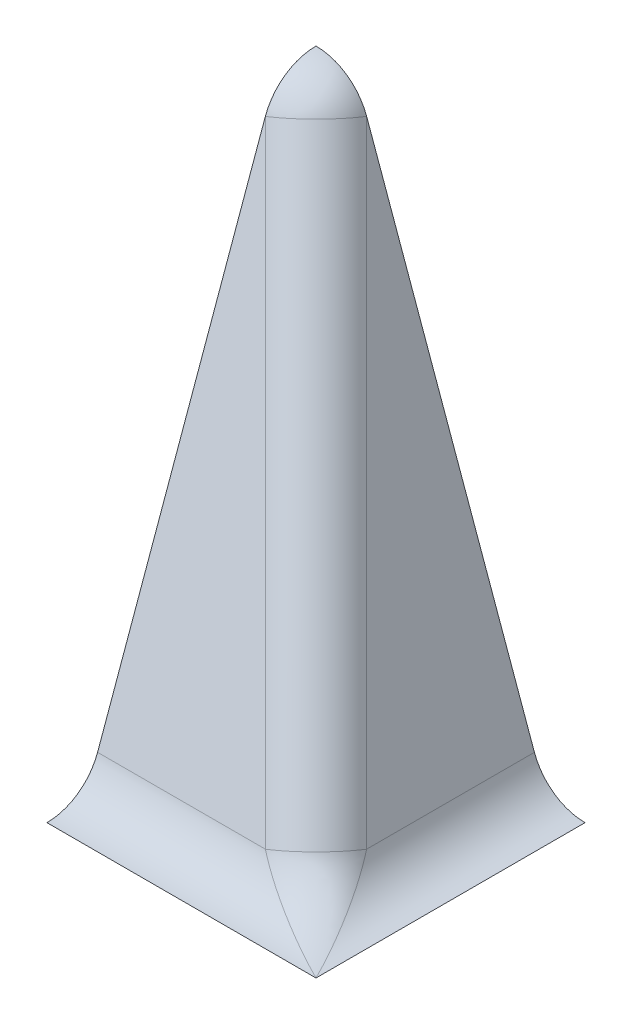
ISO-10303-21;
HEADER;
FILE_DESCRIPTION(('STEP AP214'),'2;1');
FILE_NAME('part.step','',(''),(''),'','','');
FILE_SCHEMA(('AUTOMOTIVE_DESIGN { 1 0 10303 214 1 1 1 1 }'));
ENDSEC;
DATA;
#1=APPLICATION_CONTEXT('core data for automotive mechanical design processes');
#2=APPLICATION_PROTOCOL_DEFINITION('international standard','automotive_design',2000,#1);
#3=PRODUCT_CONTEXT('',#1,'mechanical');
#4=PRODUCT('Part','Part','',(#3));
#5=PRODUCT_RELATED_PRODUCT_CATEGORY('part','',(#4));
#6=PRODUCT_DEFINITION_FORMATION('','',#4);
#7=PRODUCT_DEFINITION_CONTEXT('part definition',#1,'design');
#8=PRODUCT_DEFINITION('design','',#6,#7);
#9=PRODUCT_DEFINITION_SHAPE('','',#8);
#10=(LENGTH_UNIT() NAMED_UNIT(*) SI_UNIT(.MILLI.,.METRE.));
#11=(NAMED_UNIT(*) PLANE_ANGLE_UNIT() SI_UNIT($,.RADIAN.));
#12=(NAMED_UNIT(*) SI_UNIT($,.STERADIAN.) SOLID_ANGLE_UNIT());
#13=UNCERTAINTY_MEASURE_WITH_UNIT(LENGTH_MEASURE(1.E-05),#10,'distance_accuracy_value','');
#14=(GEOMETRIC_REPRESENTATION_CONTEXT(3) GLOBAL_UNCERTAINTY_ASSIGNED_CONTEXT((#13)) GLOBAL_UNIT_ASSIGNED_CONTEXT((#10,
#11,#12)) REPRESENTATION_CONTEXT('',''));
#15=CARTESIAN_POINT('',(0.,0.,0.));
#16=DIRECTION('',(0.,0.,1.));
#17=DIRECTION('',(1.,0.,0.));
#18=AXIS2_PLACEMENT_3D('',#15,#16,#17);
#19=CARTESIAN_POINT('',(1000.,200.,0.));
#20=DIRECTION('',(-1.,0.,0.));
#21=DIRECTION('',(0.,0.,1.));
#22=AXIS2_PLACEMENT_3D('',#19,#20,#21);
#23=CYLINDRICAL_SURFACE('',#22,200.);
#24=DIRECTION('',(-1.,0.,0.));
#25=VECTOR('',#24,1.);
#26=CARTESIAN_POINT('',(1000.,0.,0.));
#27=LINE('',#26,#25);
#28=CARTESIAN_POINT('',(1000.,0.,0.));
#29=VERTEX_POINT('',#28);
#30=CARTESIAN_POINT('',(0.,0.,0.));
#31=VERTEX_POINT('',#30);
#32=EDGE_CURVE('E99',#29,#31,#27,.T.);
#33=ORIENTED_EDGE('',*,*,#32,.F.);
#34=CARTESIAN_POINT('',(1000.,200.,0.));
#35=DIRECTION('',(0.447213595499958,0.,-0.894427190999916));
#36=DIRECTION('',(0.894427190999916,0.,0.447213595499958));
#37=AXIS2_PLACEMENT_3D('',#34,#35,#36);
#38=ELLIPSE('',#37,447.213595499958,200.);
#39=CARTESIAN_POINT('',(623.56694086138,132.364669019181,-188.21652956931));
#40=VERTEX_POINT('',#39);
#41=EDGE_CURVE('E54',#29,#40,#38,.T.);
#42=ORIENTED_EDGE('',*,*,#41,.T.);
#43=DIRECTION('',(-1.,0.,0.));
#44=VECTOR('',#43,1.);
#45=CARTESIAN_POINT('',(1000.,132.364669019181,-188.21652956931));
#46=LINE('',#45,#44);
#47=CARTESIAN_POINT('',(0.,132.364669019181,-188.21652956931));
#48=VERTEX_POINT('',#47);
#49=EDGE_CURVE('E100',#40,#48,#46,.T.);
#50=ORIENTED_EDGE('',*,*,#49,.T.);
#51=CARTESIAN_POINT('',(0.,200.,0.));
#52=DIRECTION('',(-1.,0.,0.));
#53=DIRECTION('',(0.,0.,-1.));
#54=AXIS2_PLACEMENT_3D('',#51,#52,#53);
#55=CIRCLE('',#54,200.);
#56=EDGE_CURVE('E123',#48,#31,#55,.T.);
#57=ORIENTED_EDGE('',*,*,#56,.T.);
#58=EDGE_LOOP('',(#33,#42,#50,#57));
#59=FACE_BOUND('',#58,.T.);
#60=ADVANCED_FACE('F33',(#59),#23,.F.);
#61=CARTESIAN_POINT('',(1000.,0.,-1000.));
#62=DIRECTION('',(0.,0.,1.));
#63=DIRECTION('',(1.,0.,0.));
#64=AXIS2_PLACEMENT_3D('',#61,#62,#63);
#65=PLANE('',#64);
#66=CARTESIAN_POINT('',(1000.,200.,-1000.));
#67=DIRECTION('',(0.,0.,1.));
#68=DIRECTION('',(1.,0.,0.));
#69=AXIS2_PLACEMENT_3D('',#66,#67,#68);
#70=CIRCLE('',#69,200.);
#71=CARTESIAN_POINT('',(811.78347043069,132.364669019181,-1000.));
#72=VERTEX_POINT('',#71);
#73=CARTESIAN_POINT('',(1000.,1.11022302462516E-13,-1000.));
#74=VERTEX_POINT('',#73);
#75=EDGE_CURVE('E103',#72,#74,#70,.T.);
#76=ORIENTED_EDGE('',*,*,#75,.T.);
#77=DIRECTION('',(-1.,0.,0.));
#78=VECTOR('',#77,1.);
#79=CARTESIAN_POINT('',(1000.,0.,-1000.));
#80=LINE('',#79,#78);
#81=CARTESIAN_POINT('',(0.,0.,-1000.));
#82=VERTEX_POINT('',#81);
#83=EDGE_CURVE('E90',#74,#82,#80,.T.);
#84=ORIENTED_EDGE('',*,*,#83,.T.);
#85=DIRECTION('',(0.,1.,0.));
#86=VECTOR('',#85,1.);
#87=CARTESIAN_POINT('',(0.,0.,-1000.));
#88=LINE('',#87,#86);
#89=CARTESIAN_POINT('',(0.,2000.,-1000.));
#90=VERTEX_POINT('',#89);
#91=EDGE_CURVE('E127',#82,#90,#88,.T.);
#92=ORIENTED_EDGE('',*,*,#91,.T.);
#93=CARTESIAN_POINT('',(0.,1800.,-1000.));
#94=DIRECTION('',(0.,0.,1.));
#95=DIRECTION('',(1.,0.,0.));
#96=AXIS2_PLACEMENT_3D('',#93,#94,#95);
#97=CIRCLE('',#96,200.);
#98=CARTESIAN_POINT('',(188.21652956931,1867.63533098082,-1000.));
#99=VERTEX_POINT('',#98);
#100=EDGE_CURVE('E164',#90,#99,#97,.F.);
#101=ORIENTED_EDGE('',*,*,#100,.T.);
#102=DIRECTION('',(0.338176654904095,-0.941082647846552,0.));
#103=VECTOR('',#102,1.);
#104=CARTESIAN_POINT('',(188.21652956931,1867.63533098082,-1000.));
#105=LINE('',#104,#103);
#106=EDGE_CURVE('E106',#99,#72,#105,.T.);
#107=ORIENTED_EDGE('',*,*,#106,.T.);
#108=EDGE_LOOP('',(#76,#84,#92,#101,#107));
#109=FACE_BOUND('',#108,.T.);
#110=ADVANCED_FACE('F104',(#109),#65,.F.);
#111=CARTESIAN_POINT('',(1000.,132.364669019181,-188.21652956931));
#112=DIRECTION('',(0.,-0.338176654904095,-0.941082647846552));
#113=DIRECTION('',(0.,0.941082647846552,-0.338176654904095));
#114=AXIS2_PLACEMENT_3D('',#111,#112,#113);
#115=PLANE('',#114);
#116=ORIENTED_EDGE('',*,*,#49,.F.);
#117=DIRECTION('',(0.320354031960646,-0.891485607518773,0.320354031960646));
#118=VECTOR('',#117,1.);
#119=CARTESIAN_POINT('',(19.3160424055727,1813.88238242762,-792.467428025117));
#120=LINE('',#119,#118);
#121=CARTESIAN_POINT('',(0.,1867.63533098082,-811.78347043069));
#122=VERTEX_POINT('',#121);
#123=EDGE_CURVE('E11',#40,#122,#120,.F.);
#124=ORIENTED_EDGE('',*,*,#123,.T.);
#125=DIRECTION('',(0.,-0.941082647846552,0.338176654904095));
#126=VECTOR('',#125,1.);
#127=CARTESIAN_POINT('',(0.,132.364669019181,-188.21652956931));
#128=LINE('',#127,#126);
#129=EDGE_CURVE('E113',#122,#48,#128,.T.);
#130=ORIENTED_EDGE('',*,*,#129,.T.);
#131=EDGE_LOOP('',(#116,#124,#130));
#132=FACE_BOUND('',#131,.T.);
#133=ADVANCED_FACE('F154',(#132),#115,.F.);
#134=CARTESIAN_POINT('',(1000.,0.,0.));
#135=DIRECTION('',(0.,1.,0.));
#136=DIRECTION('',(0.,0.,1.));
#137=AXIS2_PLACEMENT_3D('',#134,#135,#136);
#138=PLANE('',#137);
#139=DIRECTION('',(0.,0.,-1.));
#140=VECTOR('',#139,1.);
#141=CARTESIAN_POINT('',(0.,0.,0.));
#142=LINE('',#141,#140);
#143=EDGE_CURVE('E96',#31,#82,#142,.T.);
#144=ORIENTED_EDGE('',*,*,#143,.T.);
#145=ORIENTED_EDGE('',*,*,#83,.F.);
#146=DIRECTION('',(0.,0.,-1.));
#147=VECTOR('',#146,1.);
#148=CARTESIAN_POINT('',(1000.,0.,0.));
#149=LINE('',#148,#147);
#150=EDGE_CURVE('E95',#29,#74,#149,.T.);
#151=ORIENTED_EDGE('',*,*,#150,.F.);
#152=ORIENTED_EDGE('',*,*,#32,.T.);
#153=EDGE_LOOP('',(#144,#145,#151,#152));
#154=FACE_BOUND('',#153,.T.);
#155=ADVANCED_FACE('F92',(#154),#138,.F.);
#156=CARTESIAN_POINT('',(0.,200.,0.));
#157=DIRECTION('',(1.,0.,0.));
#158=DIRECTION('',(0.,0.,-1.));
#159=AXIS2_PLACEMENT_3D('',#156,#157,#158);
#160=PLANE('',#159);
#161=ORIENTED_EDGE('',*,*,#56,.F.);
#162=ORIENTED_EDGE('',*,*,#129,.F.);
#163=CARTESIAN_POINT('',(0.,1800.,-1000.));
#164=DIRECTION('',(1.,0.,0.));
#165=DIRECTION('',(0.,0.,-1.));
#166=AXIS2_PLACEMENT_3D('',#163,#164,#165);
#167=CIRCLE('',#166,200.);
#168=EDGE_CURVE('E117',#90,#122,#167,.T.);
#169=ORIENTED_EDGE('',*,*,#168,.F.);
#170=ORIENTED_EDGE('',*,*,#91,.F.);
#171=ORIENTED_EDGE('',*,*,#143,.F.);
#172=EDGE_LOOP('',(#161,#162,#169,#170,#171));
#173=FACE_BOUND('',#172,.T.);
#174=ADVANCED_FACE('F168',(#173),#160,.F.);
#175=CARTESIAN_POINT('',(188.21652956931,1867.63533098082,-5311.86217847897));
#176=DIRECTION('',(0.941082647846552,0.338176654904095,0.));
#177=DIRECTION('',(-0.338176654904095,0.941082647846552,0.));
#178=AXIS2_PLACEMENT_3D('',#175,#176,#177);
#179=PLANE('',#178);
#180=ORIENTED_EDGE('',*,*,#106,.F.);
#181=DIRECTION('',(0.320354031960646,-0.891485607518773,0.320354031960646));
#182=VECTOR('',#181,1.);
#183=CARTESIAN_POINT('',(831.099512836263,78.6117204659825,-357.117016733048));
#184=LINE('',#183,#182);
#185=CARTESIAN_POINT('',(811.78347043069,132.364669019181,-376.433059138621));
#186=VERTEX_POINT('',#185);
#187=EDGE_CURVE('E46',#99,#186,#184,.T.);
#188=ORIENTED_EDGE('',*,*,#187,.T.);
#189=DIRECTION('',(0.,0.,1.));
#190=VECTOR('',#189,1.);
#191=CARTESIAN_POINT('',(811.78347043069,132.364669019181,-5311.86217847897));
#192=LINE('',#191,#190);
#193=EDGE_CURVE('E121',#72,#186,#192,.T.);
#194=ORIENTED_EDGE('',*,*,#193,.F.);
#195=EDGE_LOOP('',(#180,#188,#194));
#196=FACE_BOUND('',#195,.T.);
#197=ADVANCED_FACE('F149',(#196),#179,.T.);
#198=CARTESIAN_POINT('',(1000.,200.,-5311.86217847897));
#199=DIRECTION('',(0.,0.,1.));
#200=DIRECTION('',(1.,0.,0.));
#201=AXIS2_PLACEMENT_3D('',#198,#199,#200);
#202=CYLINDRICAL_SURFACE('',#201,200.);
#203=ORIENTED_EDGE('',*,*,#193,.T.);
#204=CARTESIAN_POINT('',(1000.,200.,0.));
#205=DIRECTION('',(0.894427190999916,0.,-0.447213595499958));
#206=DIRECTION('',(0.447213595499958,0.,0.894427190999916));
#207=AXIS2_PLACEMENT_3D('',#204,#205,#206);
#208=ELLIPSE('',#207,447.213595499958,200.);
#209=EDGE_CURVE('E112',#186,#29,#208,.F.);
#210=ORIENTED_EDGE('',*,*,#209,.T.);
#211=ORIENTED_EDGE('',*,*,#150,.T.);
#212=ORIENTED_EDGE('',*,*,#75,.F.);
#213=EDGE_LOOP('',(#203,#210,#211,#212));
#214=FACE_BOUND('',#213,.T.);
#215=ADVANCED_FACE('F110',(#214),#202,.F.);
#216=CARTESIAN_POINT('',(1000.,400.,0.));
#217=CARTESIAN_POINT('',(1000.,400.,0.));
#218=CARTESIAN_POINT('',(1000.,400.,0.));
#219=CARTESIAN_POINT('',(995.643086084384,399.999985981453,-2.17845695781047));
#220=CARTESIAN_POINT('',(996.732312609739,400.000092570023,-3.26768739026429));
#221=CARTESIAN_POINT('',(997.821543042191,399.999985981453,-4.35691391562041));
#222=CARTESIAN_POINT('',(991.286179517606,399.964406855233,-4.35691024119943));
#223=CARTESIAN_POINT('',(993.464052759443,399.92881060137,-6.53594724056103));
#224=CARTESIAN_POINT('',(995.643089758803,399.964406855233,-8.71382048239853));
#225=CARTESIAN_POINT('',(982.574669451822,399.82201887214,-8.71266527409083));
#226=CARTESIAN_POINT('',(986.933911702083,399.644047213728,-13.0660882979194));
#227=CARTESIAN_POINT('',(991.287334725911,399.82201887214,-17.425330548182));
#228=CARTESIAN_POINT('',(978.220065966791,399.715209587856,-10.8899670166051));
#229=CARTESIAN_POINT('',(983.670870222134,399.430463598375,-16.3291297778671));
#230=CARTESIAN_POINT('',(989.110032983396,399.715209587856,-21.7799340332111));
#231=CARTESIAN_POINT('',(969.51514488863,399.430250055467,-15.242427555685));
#232=CARTESIAN_POINT('',(977.156161204687,398.861167658982,-22.8438387953141));
#233=CARTESIAN_POINT('',(984.757572444316,399.430250055466,-30.4848551113708));
#234=CARTESIAN_POINT('',(965.164827677374,399.25209394171,-17.4175861613135));
#235=CARTESIAN_POINT('',(973.903342500865,398.505240910315,-26.0966574991365));
#236=CARTESIAN_POINT('',(982.582413838687,399.252093941709,-34.8351723226273));
#237=CARTESIAN_POINT('',(956.4713314158,398.824251888562,-21.7643342921009));
#238=CARTESIAN_POINT('',(967.414748888116,397.65164210636,-32.585251111885));
#239=CARTESIAN_POINT('',(978.2356657079,398.824251888562,-43.5286685842015));
#240=CARTESIAN_POINT('',(952.128152352188,398.574566082532,-23.9359238239064));
#241=CARTESIAN_POINT('',(964.177836107292,397.153666443073,-35.8221638927084));
#242=CARTESIAN_POINT('',(976.064076176094,398.574566082532,-47.8718476478123));
#243=CARTESIAN_POINT('',(939.186777591037,397.722689535543,-30.4066112044808));
#244=CARTESIAN_POINT('',(954.548919349899,395.456004023807,-45.4510806501007));
#245=CARTESIAN_POINT('',(969.593388795519,397.722689535543,-60.8132224089625));
#246=CARTESIAN_POINT('',(930.601920145415,397.015230978533,-34.6990399272908));
#247=CARTESIAN_POINT('',(948.18952944113,394.047583849809,-51.8104705588706));
#248=CARTESIAN_POINT('',(965.300960072709,397.015230978533,-69.3980798545853));
#249=CARTESIAN_POINT('',(913.489281856307,395.315129402417,-43.2553590718452));
#250=CARTESIAN_POINT('',(935.606653135612,390.680936291135,-64.3933468643887));
#251=CARTESIAN_POINT('',(956.744640928155,395.315129402417,-86.510718143694));
#252=CARTESIAN_POINT('',(904.961499742667,394.322492751396,-47.5192501286662));
#253=CARTESIAN_POINT('',(929.374903381872,388.718008777085,-70.6250966181278));
#254=CARTESIAN_POINT('',(952.480749871334,394.322492751396,-95.0385002573331));
#255=CARTESIAN_POINT('',(888.125378045754,392.066877435512,-55.9373109771236));
#256=CARTESIAN_POINT('',(917.195997314521,384.287821824396,-82.8040026854787));
#257=CARTESIAN_POINT('',(944.062689022876,392.066877435512,-111.874621954246));
#258=CARTESIAN_POINT('',(879.815754761438,390.808702676096,-60.092122619281));
#259=CARTESIAN_POINT('',(911.23798283431,381.823375135851,-88.7620171656905));
#260=CARTESIAN_POINT('',(939.907877380719,390.808702676096,-120.184245238562));
#261=CARTESIAN_POINT('',(863.292903489369,388.007492375769,-68.3535482553159));
#262=CARTESIAN_POINT('',(899.543763921972,376.381422704712,-100.456236078029));
#263=CARTESIAN_POINT('',(931.646451744684,388.007492375769,-136.707096510632));
#264=CARTESIAN_POINT('',(855.079675085288,386.464458065641,-72.460162457357));
#265=CARTESIAN_POINT('',(893.80121785618,373.396627294825,-106.19878214382));
#266=CARTESIAN_POINT('',(927.539837542643,386.464458065641,-144.920324914712));
#267=CARTESIAN_POINT('',(838.974109747264,383.128886212486,-80.512945126367));
#268=CARTESIAN_POINT('',(882.727635063959,367.010399337594,-117.272364936041));
#269=CARTESIAN_POINT('',(919.487054873633,383.128886212486,-161.025890252736));
#270=CARTESIAN_POINT('',(831.078848851021,381.343418864328,-84.4605755744865));
#271=CARTESIAN_POINT('',(877.383950313126,363.612347830722,-122.616049686874));
#272=CARTESIAN_POINT('',(915.539424425514,381.343418864328,-168.92115114898));
#273=CARTESIAN_POINT('',(815.427750548502,377.488859412002,-92.2861247257468));
#274=CARTESIAN_POINT('',(867.006912782094,356.365157930276,-132.993087217906));
#275=CARTESIAN_POINT('',(907.713875274253,377.488859412002,-184.572249451499));
#276=CARTESIAN_POINT('',(807.671911417236,375.419770819662,-96.1640442913825));
#277=CARTESIAN_POINT('',(861.970056605789,352.507119717161,-138.02994339421));
#278=CARTESIAN_POINT('',(903.835955708618,375.419770819662,-192.328088582764));
#279=CARTESIAN_POINT('',(792.571839776744,371.060755602901,-103.714080111627));
#280=CARTESIAN_POINT('',(852.418347200413,344.501938805633,-147.581652799586));
#281=CARTESIAN_POINT('',(896.285919888373,371.0607556029,-207.428160223256));
#282=CARTESIAN_POINT('',(785.222358902956,368.779934070955,-107.388820548517));
#283=CARTESIAN_POINT('',(847.888677273831,340.357675596291,-152.111322726169));
#284=CARTESIAN_POINT('',(892.611179451483,368.779934070955,-214.777641097044));
#285=CARTESIAN_POINT('',(770.710229335422,363.937714172793,-114.644885332285));
#286=CARTESIAN_POINT('',(839.227149965009,331.715358093225,-160.772850034991));
#287=CARTESIAN_POINT('',(885.355114667715,363.937714172793,-229.289770664578));
#288=CARTESIAN_POINT('',(763.547577476896,361.376320563139,-118.226211261553));
#289=CARTESIAN_POINT('',(835.09536540267,327.208343433025,-164.90463459733));
#290=CARTESIAN_POINT('',(881.773788738447,361.376320563139,-236.452422523104));
#291=CARTESIAN_POINT('',(749.710652540207,356.067596911921,-125.144673729895));
#292=CARTESIAN_POINT('',(827.437444239726,318.07484094446,-172.562555760274));
#293=CARTESIAN_POINT('',(874.855326270105,356.067596911921,-250.289347459793));
#294=CARTESIAN_POINT('',(743.028159160945,353.330998288834,-128.48592041952));
#295=CARTESIAN_POINT('',(823.894393978917,313.449297258112,-176.105606021083));
#296=CARTESIAN_POINT('',(871.51407958048,353.330998288834,-256.971840839055));
#297=CARTESIAN_POINT('',(729.902805152029,347.583537593108,-135.048597423978));
#298=CARTESIAN_POINT('',(817.283079845907,303.988700727488,-182.716920154093));
#299=CARTESIAN_POINT('',(864.951402576022,347.583537593108,-270.097194847971));
#300=CARTESIAN_POINT('',(723.459938878611,344.572681985616,-138.270030560695));
#301=CARTESIAN_POINT('',(814.218714814165,299.146802125362,-185.781285185835));
#302=CARTESIAN_POINT('',(861.729969439305,344.572681985616,-276.540061121389));
#303=CARTESIAN_POINT('',(711.12247365067,338.403949231309,-144.438763174665));
#304=CARTESIAN_POINT('',(808.736842071907,289.553559350496,-191.263157928093));
#305=CARTESIAN_POINT('',(855.561236825335,338.403949231309,-288.87752634933));
#306=CARTESIAN_POINT('',(705.2162107649,335.257757246552,-147.391894617544));
#307=CARTESIAN_POINT('',(806.301136029742,284.799606398326,-193.698863970258));
#308=CARTESIAN_POINT('',(852.608105382456,335.257757246552,-294.7837892351));
#309=CARTESIAN_POINT('',(693.701903224748,328.702735209711,-153.149048387619));
#310=CARTESIAN_POINT('',(801.951889746767,275.280840530632,-198.048110253233));
#311=CARTESIAN_POINT('',(846.850951612381,328.70273520971,-306.298096775252));
#312=CARTESIAN_POINT('',(688.09384905676,325.29391354468,-155.953075471619));
#313=CARTESIAN_POINT('',(800.045370104668,270.513780500161,-199.954629895332));
#314=CARTESIAN_POINT('',(844.046924528381,325.29391354468,-311.90615094324));
#315=CARTESIAN_POINT('',(677.46704372681,318.369367760935,-161.266478136596));
#316=CARTESIAN_POINT('',(796.856754320209,261.307639268776,-203.143245679791));
#317=CARTESIAN_POINT('',(838.733521863404,318.369367760935,-322.53295627319));
#318=CARTESIAN_POINT('',(672.43314628237,314.865279727535,-163.783426858814));
#319=CARTESIAN_POINT('',(795.556998342448,256.861174928002,-204.443001657553));
#320=CARTESIAN_POINT('',(836.216573141186,314.865279727535,-327.56685371763));
#321=CARTESIAN_POINT('',(662.726812617503,307.613775327575,-168.636593691247));
#322=CARTESIAN_POINT('',(793.467455019395,248.20045050985,-206.532544980605));
#323=CARTESIAN_POINT('',(831.363406308753,307.613775327575,-337.273187382497));
#324=CARTESIAN_POINT('',(658.054361357503,303.866369097297,-170.972819321248));
#325=CARTESIAN_POINT('',(792.685740246229,243.99029937015,-207.31425975377));
#326=CARTESIAN_POINT('',(829.027180678752,303.866369097297,-341.945638642497));
#327=CARTESIAN_POINT('',(651.455328985735,298.151470647923,-174.272335507133));
#328=CARTESIAN_POINT('',(791.896712195577,238.070332878637,-208.103287804423));
#329=CARTESIAN_POINT('',(825.727664492867,298.151470647923,-348.544671014265));
#330=CARTESIAN_POINT('',(649.368348615612,296.275748272084,-175.315825692195));
#331=CARTESIAN_POINT('',(791.69798199305,236.192246969848,-208.30201800695));
#332=CARTESIAN_POINT('',(824.684174307805,296.275748272084,-350.631651384388));
#333=CARTESIAN_POINT('',(645.295198271302,292.470435736189,-177.352400864348));
#334=CARTESIAN_POINT('',(791.408622967789,232.539149687611,-208.591377032211));
#335=CARTESIAN_POINT('',(822.647599135652,292.470435736189,-354.704801728699));
#336=CARTESIAN_POINT('',(643.30901913715,290.540850495524,-178.345490431422));
#337=CARTESIAN_POINT('',(791.318806131024,230.765173276994,-208.681193868976));
#338=CARTESIAN_POINT('',(821.654509568578,290.540850495524,-356.69098086285));
#339=CARTESIAN_POINT('',(639.443563048263,286.628659888293,-180.278218475865));
#340=CARTESIAN_POINT('',(791.240601964452,227.336292244279,-208.759398035548));
#341=CARTESIAN_POINT('',(819.721781524135,286.628659888293,-360.556436951737));
#342=CARTESIAN_POINT('',(637.5642934001,284.646050911479,-181.21785329995));
#343=CARTESIAN_POINT('',(791.252969758162,225.682620479237,-208.747030241838));
#344=CARTESIAN_POINT('',(818.782146700051,284.646050911479,-362.435706599901));
#345=CARTESIAN_POINT('',(633.919407885684,280.629478514495,-183.040296057158));
#346=CARTESIAN_POINT('',(791.370097390905,222.509881543635,-208.629902609095));
#347=CARTESIAN_POINT('',(816.959703942842,280.629478514495,-366.080592114316));
#348=CARTESIAN_POINT('',(632.153780846175,278.595520170418,-183.923109576911));
#349=CARTESIAN_POINT('',(791.475492288582,220.992173845779,-208.524507711418));
#350=CARTESIAN_POINT('',(816.076890423089,278.595520170418,-367.846219153825));
#351=CARTESIAN_POINT('',(628.809266401561,274.558334507942,-185.595366799221));
#352=CARTESIAN_POINT('',(791.761561563591,218.161775569073,-208.238438436408));
#353=CARTESIAN_POINT('',(814.404633200779,274.558334507942,-371.190733598439));
#354=CARTESIAN_POINT('',(627.225777226387,272.557013979082,-186.387111386813));
#355=CARTESIAN_POINT('',(791.939634460055,216.844370913283,-208.060365539945));
#356=CARTESIAN_POINT('',(813.612888613188,272.557013979082,-372.774222773613));
#357=CARTESIAN_POINT('',(624.17568256302,268.510545717426,-187.912158718483));
#358=CARTESIAN_POINT('',(792.358454091456,214.356757704865,-207.641545908545));
#359=CARTESIAN_POINT('',(812.087841281517,268.510545717426,-375.82431743698));
#360=CARTESIAN_POINT('',(622.709064834409,266.46540260289,-188.645467582771));
#361=CARTESIAN_POINT('',(792.59952144573,213.187906858608,-207.400478554271));
#362=CARTESIAN_POINT('',(811.354532417229,266.46540260289,-377.290935165591));
#363=CARTESIAN_POINT('',(619.898349194697,262.333346145366,-190.050825402628));
#364=CARTESIAN_POINT('',(793.130335092017,211.004712439734,-206.869664907983));
#365=CARTESIAN_POINT('',(809.949174597373,262.333346145366,-380.101650805303));
#366=CARTESIAN_POINT('',(618.554254300683,260.246431775316,-190.722872849653));
#367=CARTESIAN_POINT('',(793.420269822428,209.991753526072,-206.579730177572));
#368=CARTESIAN_POINT('',(809.277127150348,260.246431775316,-381.445745699317));
#369=CARTESIAN_POINT('',(615.994360386626,256.033593081591,-192.002819806693));
#370=CARTESIAN_POINT('',(794.033154462321,208.124435099188,-205.966845537679));
#371=CARTESIAN_POINT('',(807.997180193307,256.033593081591,-384.005639613374));
#372=CARTESIAN_POINT('',(614.778560617184,253.907668985866,-192.610719691407));
#373=CARTESIAN_POINT('',(794.356149455917,207.271408269226,-205.643850544083));
#374=CARTESIAN_POINT('',(807.389280308593,253.907668985866,-385.221439382816));
#375=CARTESIAN_POINT('',(612.515078712207,249.683954397237,-193.742460643897));
#376=CARTESIAN_POINT('',(795.008313290212,205.747071662117,-204.991686709787));
#377=CARTESIAN_POINT('',(806.257539356103,249.683954397237,-387.484921287793));
#378=CARTESIAN_POINT('',(611.46346107466,247.587218875031,-194.268269462678));
#379=CARTESIAN_POINT('',(795.336977119013,205.072124765915,-204.663022880987));
#380=CARTESIAN_POINT('',(805.731730537322,247.587218875031,-388.53653892534));
#381=CARTESIAN_POINT('',(609.490918247829,243.363208423579,-195.254540876077));
#382=CARTESIAN_POINT('',(795.993395580669,203.867077836458,-204.006604419331));
#383=CARTESIAN_POINT('',(804.745459123923,243.363208423579,-390.509081752171));
#384=CARTESIAN_POINT('',(608.569992386733,241.235933651379,-195.715003806599));
#385=CARTESIAN_POINT('',(796.320968312562,203.337967669178,-203.679031687438));
#386=CARTESIAN_POINT('',(804.284996193401,241.235933651379,-391.430007613267));
#387=CARTESIAN_POINT('',(606.863227036165,236.954485862649,-196.568386481883));
#388=CARTESIAN_POINT('',(796.959113342349,202.415700283198,-203.040886657651));
#389=CARTESIAN_POINT('',(803.431613518117,236.954485862649,-393.136772963835));
#390=CARTESIAN_POINT('',(606.077384445666,234.800313464809,-196.961307777158));
#391=CARTESIAN_POINT('',(797.269429152224,202.023361861688,-202.730570847776));
#392=CARTESIAN_POINT('',(803.038692222842,234.800313464809,-393.922615554334));
#393=CARTESIAN_POINT('',(604.644663424254,230.46896392002,-197.677668287882));
#394=CARTESIAN_POINT('',(797.857661106272,201.361010382628,-202.142338893728));
#395=CARTESIAN_POINT('',(802.322331712118,230.46896392002,-395.355336575746));
#396=CARTESIAN_POINT('',(603.997784611628,228.291786836278,-198.001107694188));
#397=CARTESIAN_POINT('',(798.135279128516,201.091629232477,-201.864720871484));
#398=CARTESIAN_POINT('',(801.998892305812,228.291786836278,-396.002215388372));
#399=CARTESIAN_POINT('',(602.855711395462,223.95433352809,-198.572144302267));
#400=CARTESIAN_POINT('',(798.63998164395,200.660540517236,-201.36001835605));
#401=CARTESIAN_POINT('',(801.427855697733,223.95433352809,-397.144288604538));
#402=CARTESIAN_POINT('',(602.35821624178,221.794360341522,-198.820891879111));
#403=CARTESIAN_POINT('',(798.867538134501,200.497561135597,-201.132461865499));
#404=CARTESIAN_POINT('',(801.179108120889,221.794360341522,-397.64178375822));
#405=CARTESIAN_POINT('',(601.503478989636,217.460574635524,-199.248260505181));
#406=CARTESIAN_POINT('',(799.26652140357,200.251090198701,-200.73347859643));
#407=CARTESIAN_POINT('',(800.751739494819,217.460574635524,-398.496521010364));
#408=CARTESIAN_POINT('',(601.146236323297,215.286762172166,-199.426881838344));
#409=CARTESIAN_POINT('',(799.437694426338,200.1678497901,-200.562305573662));
#410=CARTESIAN_POINT('',(800.573118161656,215.286762172166,-398.853763676703));
#411=CARTESIAN_POINT('',(600.57388500817,210.929813276401,-199.713057495908));
#412=CARTESIAN_POINT('',(799.715319836448,200.056343589536,-200.284680163552));
#413=CARTESIAN_POINT('',(800.286942504092,210.929813276401,-399.42611499183));
#414=CARTESIAN_POINT('',(600.358775000452,208.746676933341,-199.820612499772));
#415=CARTESIAN_POINT('',(799.821583381844,200.028194618874,-200.178416618157));
#416=CARTESIAN_POINT('',(800.179387500228,208.746676933341,-399.641224999549));
#417=CARTESIAN_POINT('',(600.07183241835,204.375693730272,-199.964083790827));
#418=CARTESIAN_POINT('',(799.963974064214,200.000010269645,-200.036025935786));
#419=CARTESIAN_POINT('',(800.035916209173,204.375693730272,-399.92816758165));
#420=CARTESIAN_POINT('',(600.,202.187846865136,-200.));
#421=CARTESIAN_POINT('',(800.,200.000005135745,-200.));
#422=CARTESIAN_POINT('',(800.,202.187846865136,-400.));
#423=CARTESIAN_POINT('',(600.,197.812153134864,-200.));
#424=CARTESIAN_POINT('',(800.,199.999994864255,-200.));
#425=CARTESIAN_POINT('',(800.,197.812153134864,-400.));
#426=CARTESIAN_POINT('',(600.07183241835,195.624306269728,-199.964083790827));
#427=CARTESIAN_POINT('',(799.963974064214,199.999989730355,-200.036025935786));
#428=CARTESIAN_POINT('',(800.035916209173,195.624306269728,-399.92816758165));
#429=CARTESIAN_POINT('',(600.358775000452,191.253323066659,-199.820612499772));
#430=CARTESIAN_POINT('',(799.821583381844,199.971805381126,-200.178416618156));
#431=CARTESIAN_POINT('',(800.179387500228,191.253323066659,-399.641224999549));
#432=CARTESIAN_POINT('',(600.57388500817,189.070186723599,-199.713057495908));
#433=CARTESIAN_POINT('',(799.715319836448,199.943656410464,-200.284680163552));
#434=CARTESIAN_POINT('',(800.286942504092,189.070186723599,-399.42611499183));
#435=CARTESIAN_POINT('',(601.146236323297,184.713237827834,-199.426881838344));
#436=CARTESIAN_POINT('',(799.437694426338,199.8321502099,-200.562305573662));
#437=CARTESIAN_POINT('',(800.573118161656,184.713237827834,-398.853763676703));
#438=CARTESIAN_POINT('',(601.503478989636,182.539425364476,-199.248260505181));
#439=CARTESIAN_POINT('',(799.26652140357,199.748909801299,-200.73347859643));
#440=CARTESIAN_POINT('',(800.751739494819,182.539425364476,-398.496521010364));
#441=CARTESIAN_POINT('',(602.35821624178,178.205639658478,-198.820891879111));
#442=CARTESIAN_POINT('',(798.867538134501,199.502438864403,-201.132461865499));
#443=CARTESIAN_POINT('',(801.179108120889,178.205639658478,-397.64178375822));
#444=CARTESIAN_POINT('',(602.855711395462,176.04566647191,-198.572144302267));
#445=CARTESIAN_POINT('',(798.63998164395,199.339459482764,-201.36001835605));
#446=CARTESIAN_POINT('',(801.427855697733,176.04566647191,-397.144288604538));
#447=CARTESIAN_POINT('',(603.997784611628,171.708213163722,-198.001107694188));
#448=CARTESIAN_POINT('',(798.135279128516,198.908370767524,-201.864720871484));
#449=CARTESIAN_POINT('',(801.998892305812,171.708213163722,-396.002215388372));
#450=CARTESIAN_POINT('',(604.644663424254,169.53103607998,-197.677668287882));
#451=CARTESIAN_POINT('',(797.857661106272,198.638989617372,-202.142338893728));
#452=CARTESIAN_POINT('',(802.322331712118,169.53103607998,-395.355336575746));
#453=CARTESIAN_POINT('',(606.077384445666,165.199686535191,-196.961307777158));
#454=CARTESIAN_POINT('',(797.269429152224,197.976638138312,-202.730570847776));
#455=CARTESIAN_POINT('',(803.038692222842,165.199686535191,-393.922615554334));
#456=CARTESIAN_POINT('',(606.863227036165,163.045514137351,-196.568386481883));
#457=CARTESIAN_POINT('',(796.959113342349,197.584299716802,-203.040886657652));
#458=CARTESIAN_POINT('',(803.431613518117,163.045514137351,-393.136772963835));
#459=CARTESIAN_POINT('',(608.569992386733,158.764066348621,-195.715003806599));
#460=CARTESIAN_POINT('',(796.320968312562,196.662032330822,-203.679031687438));
#461=CARTESIAN_POINT('',(804.284996193401,158.764066348621,-391.430007613267));
#462=CARTESIAN_POINT('',(609.490918247829,156.636791576421,-195.254540876077));
#463=CARTESIAN_POINT('',(795.993395580669,196.132922163542,-204.006604419331));
#464=CARTESIAN_POINT('',(804.745459123923,156.636791576421,-390.509081752171));
#465=CARTESIAN_POINT('',(611.46346107466,152.412781124969,-194.268269462678));
#466=CARTESIAN_POINT('',(795.336977119013,194.927875234085,-204.663022880987));
#467=CARTESIAN_POINT('',(805.731730537322,152.412781124969,-388.53653892534));
#468=CARTESIAN_POINT('',(612.515078712207,150.316045602763,-193.742460643897));
#469=CARTESIAN_POINT('',(795.008313290213,194.252928337883,-204.991686709788));
#470=CARTESIAN_POINT('',(806.257539356103,150.316045602763,-387.484921287793));
#471=CARTESIAN_POINT('',(614.778560617184,146.092331014134,-192.610719691407));
#472=CARTESIAN_POINT('',(794.356149455917,192.728591730774,-205.643850544083));
#473=CARTESIAN_POINT('',(807.389280308593,146.092331014134,-385.221439382816));
#474=CARTESIAN_POINT('',(615.994360386626,143.966406918409,-192.002819806693));
#475=CARTESIAN_POINT('',(794.033154462321,191.875564900812,-205.966845537679));
#476=CARTESIAN_POINT('',(807.997180193307,143.966406918409,-384.005639613374));
#477=CARTESIAN_POINT('',(618.554254300683,139.753568224684,-190.722872849653));
#478=CARTESIAN_POINT('',(793.420269822428,190.008246473928,-206.579730177572));
#479=CARTESIAN_POINT('',(809.277127150347,139.753568224684,-381.445745699317));
#480=CARTESIAN_POINT('',(619.898349194697,137.666653854634,-190.050825402628));
#481=CARTESIAN_POINT('',(793.130335092017,188.995287560266,-206.869664907983));
#482=CARTESIAN_POINT('',(809.949174597372,137.666653854634,-380.101650805303));
#483=CARTESIAN_POINT('',(622.709064834409,133.53459739711,-188.645467582771));
#484=CARTESIAN_POINT('',(792.599521445729,186.812093141392,-207.400478554271));
#485=CARTESIAN_POINT('',(811.354532417229,133.53459739711,-377.290935165591));
#486=CARTESIAN_POINT('',(624.17568256302,131.489454282574,-187.912158718483));
#487=CARTESIAN_POINT('',(792.358454091456,185.643242295135,-207.641545908545));
#488=CARTESIAN_POINT('',(812.087841281517,131.489454282574,-375.82431743698));
#489=CARTESIAN_POINT('',(627.225777226387,127.442986020918,-186.387111386813));
#490=CARTESIAN_POINT('',(791.939634460055,183.155629086717,-208.060365539945));
#491=CARTESIAN_POINT('',(813.612888613188,127.442986020918,-372.774222773613));
#492=CARTESIAN_POINT('',(628.809266401561,125.441665492058,-185.595366799221));
#493=CARTESIAN_POINT('',(791.761561563591,181.838224430927,-208.238438436409));
#494=CARTESIAN_POINT('',(814.404633200779,125.441665492058,-371.190733598439));
#495=CARTESIAN_POINT('',(632.153780846175,121.404479829582,-183.923109576911));
#496=CARTESIAN_POINT('',(791.475492288582,179.007826154221,-208.524507711418));
#497=CARTESIAN_POINT('',(816.076890423089,121.404479829582,-367.846219153825));
#498=CARTESIAN_POINT('',(633.919407885684,119.370521485505,-183.040296057158));
#499=CARTESIAN_POINT('',(791.370097390906,177.490118456365,-208.629902609095));
#500=CARTESIAN_POINT('',(816.959703942842,119.370521485505,-366.080592114316));
#501=CARTESIAN_POINT('',(637.564293400099,115.353949088521,-181.21785329995));
#502=CARTESIAN_POINT('',(791.252969758162,174.317379520763,-208.747030241838));
#503=CARTESIAN_POINT('',(818.782146700051,115.353949088521,-362.435706599901));
#504=CARTESIAN_POINT('',(639.443563048263,113.371340111707,-180.278218475865));
#505=CARTESIAN_POINT('',(791.240601964452,172.663707755721,-208.759398035548));
#506=CARTESIAN_POINT('',(819.721781524135,113.371340111707,-360.556436951737));
#507=CARTESIAN_POINT('',(643.30901913715,109.459149504476,-178.345490431422));
#508=CARTESIAN_POINT('',(791.318806131024,169.234826723006,-208.681193868976));
#509=CARTESIAN_POINT('',(821.654509568578,109.459149504476,-356.69098086285));
#510=CARTESIAN_POINT('',(645.295198271302,107.529564263811,-177.352400864348));
#511=CARTESIAN_POINT('',(791.408622967789,167.460850312389,-208.591377032211));
#512=CARTESIAN_POINT('',(822.647599135652,107.529564263811,-354.704801728699));
#513=CARTESIAN_POINT('',(649.368348615612,103.724251727916,-175.315825692195));
#514=CARTESIAN_POINT('',(791.69798199305,163.807753030152,-208.30201800695));
#515=CARTESIAN_POINT('',(824.684174307805,103.724251727916,-350.631651384388));
#516=CARTESIAN_POINT('',(651.455328985735,101.848529352077,-174.272335507133));
#517=CARTESIAN_POINT('',(791.896712195577,161.929667121363,-208.103287804423));
#518=CARTESIAN_POINT('',(825.727664492867,101.848529352077,-348.544671014265));
#519=CARTESIAN_POINT('',(658.054361357503,96.1336309027033,-170.972819321248));
#520=CARTESIAN_POINT('',(792.685740246229,156.00970062985,-207.314259753771));
#521=CARTESIAN_POINT('',(829.027180678752,96.1336309027034,-341.945638642497));
#522=CARTESIAN_POINT('',(662.726812617503,92.3862246724251,-168.636593691247));
#523=CARTESIAN_POINT('',(793.467455019395,151.79954949015,-206.532544980605));
#524=CARTESIAN_POINT('',(831.363406308753,92.3862246724251,-337.273187382497));
#525=CARTESIAN_POINT('',(672.43314628237,85.1347202724654,-163.783426858814));
#526=CARTESIAN_POINT('',(795.556998342448,143.138825071998,-204.443001657552));
#527=CARTESIAN_POINT('',(836.216573141186,85.1347202724654,-327.56685371763));
#528=CARTESIAN_POINT('',(677.46704372681,81.6306322390649,-161.266478136596));
#529=CARTESIAN_POINT('',(796.856754320209,138.692360731224,-203.143245679791));
#530=CARTESIAN_POINT('',(838.733521863404,81.6306322390649,-322.53295627319));
#531=CARTESIAN_POINT('',(688.09384905676,74.7060864553202,-155.953075471619));
#532=CARTESIAN_POINT('',(800.045370104668,129.486219499839,-199.954629895332));
#533=CARTESIAN_POINT('',(844.046924528381,74.7060864553202,-311.90615094324));
#534=CARTESIAN_POINT('',(693.701903224748,71.2972647902895,-153.149048387619));
#535=CARTESIAN_POINT('',(801.951889746767,124.719159469368,-198.048110253233));
#536=CARTESIAN_POINT('',(846.850951612381,71.2972647902896,-306.298096775252));
#537=CARTESIAN_POINT('',(705.216210764899,64.7422427534482,-147.391894617544));
#538=CARTESIAN_POINT('',(806.301136029742,115.200393601674,-193.698863970258));
#539=CARTESIAN_POINT('',(852.608105382456,64.7422427534483,-294.783789235101));
#540=CARTESIAN_POINT('',(711.12247365067,61.5960507686907,-144.438763174665));
#541=CARTESIAN_POINT('',(808.736842071907,110.446440649504,-191.263157928093));
#542=CARTESIAN_POINT('',(855.561236825335,61.5960507686907,-288.87752634933));
#543=CARTESIAN_POINT('',(723.45993887861,55.4273180143845,-138.270030560695));
#544=CARTESIAN_POINT('',(814.218714814164,100.853197874638,-185.781285185836));
#545=CARTESIAN_POINT('',(861.729969439305,55.4273180143846,-276.54006112139));
#546=CARTESIAN_POINT('',(729.902805152029,52.4164624068919,-135.048597423978));
#547=CARTESIAN_POINT('',(817.283079845907,96.0112992725121,-182.716920154093));
#548=CARTESIAN_POINT('',(864.951402576022,52.416462406892,-270.097194847971));
#549=CARTESIAN_POINT('',(743.028159160945,46.6690017111664,-128.48592041952));
#550=CARTESIAN_POINT('',(823.894393978917,86.5507027418883,-176.105606021083));
#551=CARTESIAN_POINT('',(871.51407958048,46.6690017111664,-256.971840839055));
#552=CARTESIAN_POINT('',(749.710652540207,43.9324030880791,-125.144673729895));
#553=CARTESIAN_POINT('',(827.437444239726,81.9251590555399,-172.562555760274));
#554=CARTESIAN_POINT('',(874.855326270105,43.9324030880792,-250.289347459793));
#555=CARTESIAN_POINT('',(763.547577476896,38.6236794368614,-118.226211261553));
#556=CARTESIAN_POINT('',(835.09536540267,72.7916565669757,-164.90463459733));
#557=CARTESIAN_POINT('',(881.773788738447,38.6236794368615,-236.452422523104));
#558=CARTESIAN_POINT('',(770.710229335422,36.0622858272075,-114.644885332285));
#559=CARTESIAN_POINT('',(839.227149965009,68.2846419067751,-160.772850034991));
#560=CARTESIAN_POINT('',(885.355114667715,36.0622858272076,-229.289770664578));
#561=CARTESIAN_POINT('',(785.222358902956,31.2200659290454,-107.388820548517));
#562=CARTESIAN_POINT('',(847.888677273831,59.6423244037097,-152.111322726169));
#563=CARTESIAN_POINT('',(892.611179451483,31.2200659290455,-214.777641097044));
#564=CARTESIAN_POINT('',(792.571839776744,28.9392443970995,-103.714080111627));
#565=CARTESIAN_POINT('',(852.418347200413,55.4980611943672,-147.581652799587));
#566=CARTESIAN_POINT('',(896.285919888373,28.9392443970996,-207.428160223256));
#567=CARTESIAN_POINT('',(807.671911417236,24.5802291803378,-96.1640442913826));
#568=CARTESIAN_POINT('',(861.970056605789,47.4928802828391,-138.029943394211));
#569=CARTESIAN_POINT('',(903.835955708617,24.5802291803379,-192.328088582764));
#570=CARTESIAN_POINT('',(815.427750548502,22.5111405879985,-92.2861247257468));
#571=CARTESIAN_POINT('',(867.006912782094,43.6348420697245,-132.993087217906));
#572=CARTESIAN_POINT('',(907.713875274253,22.5111405879985,-184.572249451499));
#573=CARTESIAN_POINT('',(831.078848851021,18.6565811356724,-84.4605755744866));
#574=CARTESIAN_POINT('',(877.383950313126,36.3876521692776,-122.616049686874));
#575=CARTESIAN_POINT('',(915.539424425514,18.6565811356724,-168.92115114898));
#576=CARTESIAN_POINT('',(838.974109747264,16.8711137875135,-80.512945126367));
#577=CARTESIAN_POINT('',(882.727635063959,32.9896006624055,-117.272364936041));
#578=CARTESIAN_POINT('',(919.487054873633,16.8711137875136,-161.025890252736));
#579=CARTESIAN_POINT('',(855.079675085288,13.5355419343586,-72.460162457357));
#580=CARTESIAN_POINT('',(893.80121785618,26.603372705175,-106.19878214382));
#581=CARTESIAN_POINT('',(927.539837542643,13.5355419343587,-144.920324914712));
#582=CARTESIAN_POINT('',(863.292903489369,11.9925076242314,-68.3535482553159));
#583=CARTESIAN_POINT('',(899.543763921972,23.6185772952886,-100.456236078029));
#584=CARTESIAN_POINT('',(931.646451744684,11.9925076242314,-136.707096510632));
#585=CARTESIAN_POINT('',(879.815754761438,9.19129732390438,-60.092122619281));
#586=CARTESIAN_POINT('',(911.23798283431,18.1766248641487,-88.7620171656905));
#587=CARTESIAN_POINT('',(939.907877380719,9.1912973239044,-120.184245238562));
#588=CARTESIAN_POINT('',(888.125378045754,7.93312256448784,-55.9373109771236));
#589=CARTESIAN_POINT('',(917.195997314521,15.7121781756043,-82.8040026854786));
#590=CARTESIAN_POINT('',(944.062689022876,7.93312256448795,-111.874621954246));
#591=CARTESIAN_POINT('',(904.961499742667,5.67750724860377,-47.5192501286662));
#592=CARTESIAN_POINT('',(929.374903381872,11.2819912229149,-70.6250966181278));
#593=CARTESIAN_POINT('',(952.480749871334,5.67750724860388,-95.0385002573331));
#594=CARTESIAN_POINT('',(913.489281856307,4.68487059758345,-43.2553590718452));
#595=CARTESIAN_POINT('',(935.606653135612,9.31906370886485,-64.3933468643888));
#596=CARTESIAN_POINT('',(956.744640928155,4.68487059758347,-86.510718143694));
#597=CARTESIAN_POINT('',(930.601920145415,2.98476902146667,-34.6990399272909));
#598=CARTESIAN_POINT('',(948.18952944113,5.95241615019127,-51.8104705588707));
#599=CARTESIAN_POINT('',(965.300960072709,2.9847690214667,-69.3980798545854));
#600=CARTESIAN_POINT('',(939.186777591037,2.27731046445666,-30.4066112044809));
#601=CARTESIAN_POINT('',(954.548919349899,4.54399597619346,-45.4510806501008));
#602=CARTESIAN_POINT('',(969.593388795519,2.27731046445682,-60.8132224089626));
#603=CARTESIAN_POINT('',(952.128152352188,1.42543391746821,-23.9359238239063));
#604=CARTESIAN_POINT('',(964.177836107292,2.84633355692705,-35.8221638927083));
#605=CARTESIAN_POINT('',(976.064076176094,1.4254339174683,-47.8718476478123));
#606=CARTESIAN_POINT('',(956.4713314158,1.17574811143782,-21.7643342921008));
#607=CARTESIAN_POINT('',(967.414748888116,2.34835789364005,-32.5852511118848));
#608=CARTESIAN_POINT('',(978.2356657079,1.17574811143785,-43.5286685842012));
#609=CARTESIAN_POINT('',(965.164827677374,0.74790605829047,-17.4175861613134));
#610=CARTESIAN_POINT('',(973.903342500865,1.49475908968538,-26.0966574991363));
#611=CARTESIAN_POINT('',(982.582413838687,0.747906058290495,-34.8351723226271));
#612=CARTESIAN_POINT('',(969.51514488863,0.569749944533539,-15.2424275556849));
#613=CARTESIAN_POINT('',(977.156161204687,1.13883234101753,-22.843838795314));
#614=CARTESIAN_POINT('',(984.757572444316,0.569749944533616,-30.4848551113708));
#615=CARTESIAN_POINT('',(978.220065966791,0.284790412144458,-10.8899670166052));
#616=CARTESIAN_POINT('',(983.670870222134,0.569536401624743,-16.3291297778672));
#617=CARTESIAN_POINT('',(989.110032983396,0.284790412144547,-21.7799340332112));
#618=CARTESIAN_POINT('',(982.574669451822,0.177981127860184,-8.71266527409089));
#619=CARTESIAN_POINT('',(986.933911702083,0.355952786272244,-13.0660882979195));
#620=CARTESIAN_POINT('',(991.287334725911,0.177981127860231,-17.4253305481822));
#621=CARTESIAN_POINT('',(991.286179517606,0.0355931447666844,-4.35691024119948));
#622=CARTESIAN_POINT('',(993.464052759443,0.0711893986299144,-6.53594724056111));
#623=CARTESIAN_POINT('',(995.643089758803,0.0355931447666931,-8.71382048239864));
#624=CARTESIAN_POINT('',(995.643086084384,1.40185472185601E-05,-2.17845695781052));
#625=CARTESIAN_POINT('',(996.732312609739,-9.25700227975755E-05,-3.26768739026435));
#626=CARTESIAN_POINT('',(997.821543042191,1.40185472314499E-05,-4.3569139156205));
#627=CARTESIAN_POINT('',(1000.,0.,0.));
#628=CARTESIAN_POINT('',(1000.,1.66533453693773E-13,0.));
#629=CARTESIAN_POINT('',(1000.,1.11022302462516E-13,0.));
#630=(BOUNDED_SURFACE() B_SPLINE_SURFACE(3,2,((#216,#217,#218),(#219,#220,#221),(#222,#223,
#224),(#225,#226,#227),(#228,#229,#230),(#231,#232,#233),(#234,#235,#236),(#237,#238,#239),
(#240,#241,#242),(#243,#244,#245),(#246,#247,#248),(#249,#250,#251),(#252,#253,#254),(#255,#256,
#257),(#258,#259,#260),(#261,#262,#263),(#264,#265,#266),(#267,#268,#269),(#270,#271,#272),
(#273,#274,#275),(#276,#277,#278),(#279,#280,#281),(#282,#283,#284),(#285,#286,#287),(#288,#289,
#290),(#291,#292,#293),(#294,#295,#296),(#297,#298,#299),(#300,#301,#302),(#303,#304,#305),
(#306,#307,#308),(#309,#310,#311),(#312,#313,#314),(#315,#316,#317),(#318,#319,#320),(#321,#322,
#323),(#324,#325,#326),(#327,#328,#329),(#330,#331,#332),(#333,#334,#335),(#336,#337,#338),
(#339,#340,#341),(#342,#343,#344),(#345,#346,#347),(#348,#349,#350),(#351,#352,#353),(#354,#355,
#356),(#357,#358,#359),(#360,#361,#362),(#363,#364,#365),(#366,#367,#368),(#369,#370,#371),
(#372,#373,#374),(#375,#376,#377),(#378,#379,#380),(#381,#382,#383),(#384,#385,#386),(#387,#388,
#389),(#390,#391,#392),(#393,#394,#395),(#396,#397,#398),(#399,#400,#401),(#402,#403,#404),
(#405,#406,#407),(#408,#409,#410),(#411,#412,#413),(#414,#415,#416),(#417,#418,#419),(#420,#421,
#422),(#423,#424,#425),(#426,#427,#428),(#429,#430,#431),(#432,#433,#434),(#435,#436,#437),
(#438,#439,#440),(#441,#442,#443),(#444,#445,#446),(#447,#448,#449),(#450,#451,#452),(#453,#454,
#455),(#456,#457,#458),(#459,#460,#461),(#462,#463,#464),(#465,#466,#467),(#468,#469,#470),
(#471,#472,#473),(#474,#475,#476),(#477,#478,#479),(#480,#481,#482),(#483,#484,#485),(#486,#487,
#488),(#489,#490,#491),(#492,#493,#494),(#495,#496,#497),(#498,#499,#500),(#501,#502,#503),
(#504,#505,#506),(#507,#508,#509),(#510,#511,#512),(#513,#514,#515),(#516,#517,#518),(#519,#520,
#521),(#522,#523,#524),(#525,#526,#527),(#528,#529,#530),(#531,#532,#533),(#534,#535,#536),
(#537,#538,#539),(#540,#541,#542),(#543,#544,#545),(#546,#547,#548),(#549,#550,#551),(#552,#553,
#554),(#555,#556,#557),(#558,#559,#560),(#561,#562,#563),(#564,#565,#566),(#567,#568,#569),
(#570,#571,#572),(#573,#574,#575),(#576,#577,#578),(#579,#580,#581),(#582,#583,#584),(#585,#586,
#587),(#588,#589,#590),(#591,#592,#593),(#594,#595,#596),(#597,#598,#599),(#600,#601,#602),
(#603,#604,#605),(#606,#607,#608),(#609,#610,#611),(#612,#613,#614),(#615,#616,#617),(#618,#619,
#620),(#621,#622,#623),(#624,#625,#626),(#627,#628,#629)),.UNSPECIFIED.,.F.,.F.,
.F.) B_SPLINE_SURFACE_WITH_KNOTS((4,2,2,2,2,2,2,2,2,2,2,2,2,2,2,2,2,2,2,2,2,2,2,2,2,2,2,2,2,2,2,
2,2,2,2,2,2,2,2,2,2,2,2,2,2,2,2,2,2,2,2,2,2,2,2,2,2,2,2,2,2,2,2,2,2,2,2,2,4),(3,3),(0.,
18.4843863544908,36.9688836238989,55.4549008753036,73.9408836615837,110.595365252466,
147.249028404722,183.289083162206,219.328982206265,254.482451163942,289.635484886999,
323.671639976292,357.707218137039,390.452380828326,423.196771807308,454.549657112896,
485.901541581855,515.848465223098,545.794142118615,560.111311875606,574.427178270974,
588.744021890557,603.059455731591,616.815285892177,630.569673450514,644.324399614989,
658.079045430766,671.423043711235,684.766973395472,698.110596710028,711.454183371108,
724.580252863478,737.70626920843,750.832160053766,763.958065193573,777.08397033338,
790.209861178716,803.335877523667,816.461947016037,829.805533677118,843.149156991674,
856.49308667591,869.83708495638,883.591730772157,897.346456936631,911.100844494969,
924.856674655555,939.172108496588,953.488952116172,967.80481851154,982.121988268531,
1012.06766516405,1042.01458880529,1073.36647327425,1104.71935857984,1137.46374955882,
1170.20891225011,1204.24449041085,1238.28064550015,1273.4336792232,1308.58714818088,
1344.62704722494,1380.66710198242,1417.32076513468,1453.97524672556,1472.46122951184,
1490.94724676325,1509.43174403265,1527.91613038715),(0.,1.),
.UNSPECIFIED.) GEOMETRIC_REPRESENTATION_ITEM() RATIONAL_B_SPLINE_SURFACE(((1.,1.,1.),(1.,
1.00000001532674,1.),(1.,0.999911018497602,1.),(1.,0.999555117111611,1.),(1.,0.999288211487229,
1.),(1.,0.998576579839828,1.),(1.,0.998131839196426,1.),(1.,0.997064821253304,1.),(1.,
0.996442544284582,1.),(1.,0.994321977326357,1.),(1.,0.992563805394067,1.),(1.,0.98835489459286,
1.),(1.,0.985904171188783,1.),(1.,0.980363693419653,1.),(1.,0.977285323706167,1.),(1.,
0.970475280274674,1.),(1.,0.966743609379368,1.),(1.,0.958740872622577,1.),(1.,0.954485331097459,
1.),(1.,0.945385072157191,1.),(1.,0.940540362037272,1.),(1.,0.930451194591003,1.),(1.,
0.925224328502363,1.),(1.,0.914276396738582,1.),(1.,0.908555339441855,1.),(1.,0.8968900152678,
1.),(1.,0.890962434832481,1.),(1.,0.878746432132691,1.),(1.,0.872458018375547,1.),(1.,
0.859866149589742,1.),(1.,0.85357469006492,1.),(1.,0.840809938561065,1.),(1.,0.834336652392839,
1.),(1.,0.821606342448214,1.),(1.,0.815352626861034,1.),(1.,0.802890749219343,1.),(1.,
0.796682585279194,1.),(1.,0.787646679438445,1.),(1.,0.784745657888002,1.),(1.,0.779004330033187,
1.),(1.,0.776164018225652,1.),(1.,0.77056250660704,1.),(1.,0.767801312209512,1.),(1.,
0.762378418357195,1.),(1.,0.75971670913192,1.),(1.,0.754615229120432,1.),(1.,0.752170849914196,
1.),(1.,0.747412660592303,1.),(1.,0.745098836810481,1.),(1.,0.740621180887695,1.),(1.,
0.738457352440634,1.),(1.,0.734299603835242,1.),(1.,0.732305682684459,1.),(1.,0.728564009425426,
1.),(1.,0.726810685140371,1.),(1.,0.723499541267226,1.),(1.,0.72194172067417,1.),(1.,
0.719037727929133,1.),(1.,0.717691550918635,1.),(1.,0.71522539787121,1.),(1.,0.714105421212944,
1.),(1.,0.712120612069606,1.),(1.,0.711251918027384,1.),(1.,0.709755426781442,1.),(1.,
0.709127628602345,1.),(1.,0.708120183303921,1.),(1.,0.707740533812044,1.),(1.,0.707233832615814,
1.),(1.,0.707106781186548,1.),(1.,0.707106781186548,1.),(1.,0.707233832615814,1.),(1.,
0.707740533812044,1.),(1.,0.708120183303921,1.),(1.,0.709127628602345,1.),(1.,0.709755426781442,
1.),(1.,0.711251918027384,1.),(1.,0.712120612069606,1.),(1.,0.714105421212944,1.),(1.,
0.71522539787121,1.),(1.,0.717691550918635,1.),(1.,0.719037727929133,1.),(1.,0.72194172067417,
1.),(1.,0.723499541267226,1.),(1.,0.726810685140371,1.),(1.,0.728564009425426,1.),(1.,
0.732305682684459,1.),(1.,0.734299603835242,1.),(1.,0.738457352440634,1.),(1.,0.740621180887695,
1.),(1.,0.74509883681048,1.),(1.,0.747412660592303,1.),(1.,0.752170849914196,1.),(1.,
0.754615229120432,1.),(1.,0.75971670913192,1.),(1.,0.762378418357195,1.),(1.,0.767801312209512,
1.),(1.,0.77056250660704,1.),(1.,0.776164018225652,1.),(1.,0.779004330033187,1.),(1.,
0.784745657888002,1.),(1.,0.787646679438444,1.),(1.,0.796682585279194,1.),(1.,0.802890749219343,
1.),(1.,0.815352626861034,1.),(1.,0.821606342448214,1.),(1.,0.834336652392839,1.),(1.,
0.840809938561065,1.),(1.,0.85357469006492,1.),(1.,0.859866149589742,1.),(1.,0.872458018375547,
1.),(1.,0.878746432132691,1.),(1.,0.890962434832482,1.),(1.,0.896890015267799,1.),(1.,
0.908555339441855,1.),(1.,0.914276396738582,1.),(1.,0.925224328502362,1.),(1.,0.930451194591003,
1.),(1.,0.940540362037272,1.),(1.,0.945385072157191,1.),(1.,0.954485331097459,1.),(1.,
0.958740872622577,1.),(1.,0.966743609379368,1.),(1.,0.970475280274674,1.),(1.,0.977285323706167,
1.),(1.,0.980363693419653,1.),(1.,0.985904171188783,1.),(1.,0.98835489459286,1.),(1.,
0.992563805394067,1.),(1.,0.994321977326357,1.),(1.,0.996442544284582,1.),(1.,0.997064821253304,
1.),(1.,0.998131839196426,1.),(1.,0.998576579839828,1.),(1.,0.999288211487229,1.),(1.,
0.999555117111611,1.),(1.,0.999911018497602,1.),(1.,1.00000001532674,1.),(1.,1.,1.))) REPRESENTATION_ITEM('') SURFACE());
#631=ORIENTED_EDGE('',*,*,#41,.F.);
#632=ORIENTED_EDGE('',*,*,#209,.F.);
#633=CARTESIAN_POINT('',(623.56694086138,64.729338038362,-376.433059138621));
#634=DIRECTION('',(-0.320354031960646,0.891485607518772,-0.320354031960646));
#635=DIRECTION('',(-0.941082647846551,-0.338176654904095,0.));
#636=AXIS2_PLACEMENT_3D('',#633,#634,#635);
#637=CIRCLE('',#636,200.);
#638=EDGE_CURVE('E108',#40,#186,#637,.T.);
#639=ORIENTED_EDGE('',*,*,#638,.F.);
#640=EDGE_LOOP('',(#631,#632,#639));
#641=FACE_BOUND('',#640,.T.);
#642=ADVANCED_FACE('F35',(#641),#630,.T.);
#643=CARTESIAN_POINT('',(-442.512211212633,3031.42906937357,-1442.51221121263));
#644=DIRECTION('',(-0.320354031960646,0.891485607518773,-0.320354031960646));
#645=DIRECTION('',(-0.941082647846552,-0.338176654904095,0.));
#646=AXIS2_PLACEMENT_3D('',#643,#644,#645);
#647=CYLINDRICAL_SURFACE('',#646,200.);
#648=ORIENTED_EDGE('',*,*,#638,.T.);
#649=ORIENTED_EDGE('',*,*,#187,.F.);
#650=CARTESIAN_POINT('',(2.26364559872547E-13,1800.,-1000.));
#651=DIRECTION('',(-0.320354031960646,0.891485607518773,-0.320354031960645));
#652=DIRECTION('',(-0.941082647846552,-0.338176654904095,0.));
#653=AXIS2_PLACEMENT_3D('',#650,#651,#652);
#654=CIRCLE('',#653,200.);
#655=EDGE_CURVE('E135',#122,#99,#654,.T.);
#656=ORIENTED_EDGE('',*,*,#655,.F.);
#657=ORIENTED_EDGE('',*,*,#123,.F.);
#658=EDGE_LOOP('',(#648,#649,#656,#657));
#659=FACE_BOUND('',#658,.T.);
#660=ADVANCED_FACE('F140',(#659),#647,.T.);
#661=CARTESIAN_POINT('',(0.,1800.,-1000.));
#662=DIRECTION('',(0.,0.,1.));
#663=DIRECTION('',(1.,0.,0.));
#664=AXIS2_PLACEMENT_3D('',#661,#662,#663);
#665=SPHERICAL_SURFACE('',#664,200.);
#666=ORIENTED_EDGE('',*,*,#100,.F.);
#667=ORIENTED_EDGE('',*,*,#168,.T.);
#668=ORIENTED_EDGE('',*,*,#655,.T.);
#669=EDGE_LOOP('',(#666,#667,#668));
#670=FACE_BOUND('',#669,.T.);
#671=ADVANCED_FACE('F148',(#670),#665,.T.);
#672=CLOSED_SHELL('',(#60,#110,#133,#155,#174,#197,#215,#642,#660,#671));
#673=MANIFOLD_SOLID_BREP('B2',#672);
#674=ADVANCED_BREP_SHAPE_REPRESENTATION('',(#18,#673),#14);
#675=SHAPE_DEFINITION_REPRESENTATION(#9,#674);
ENDSEC;
END-ISO-10303-21;
